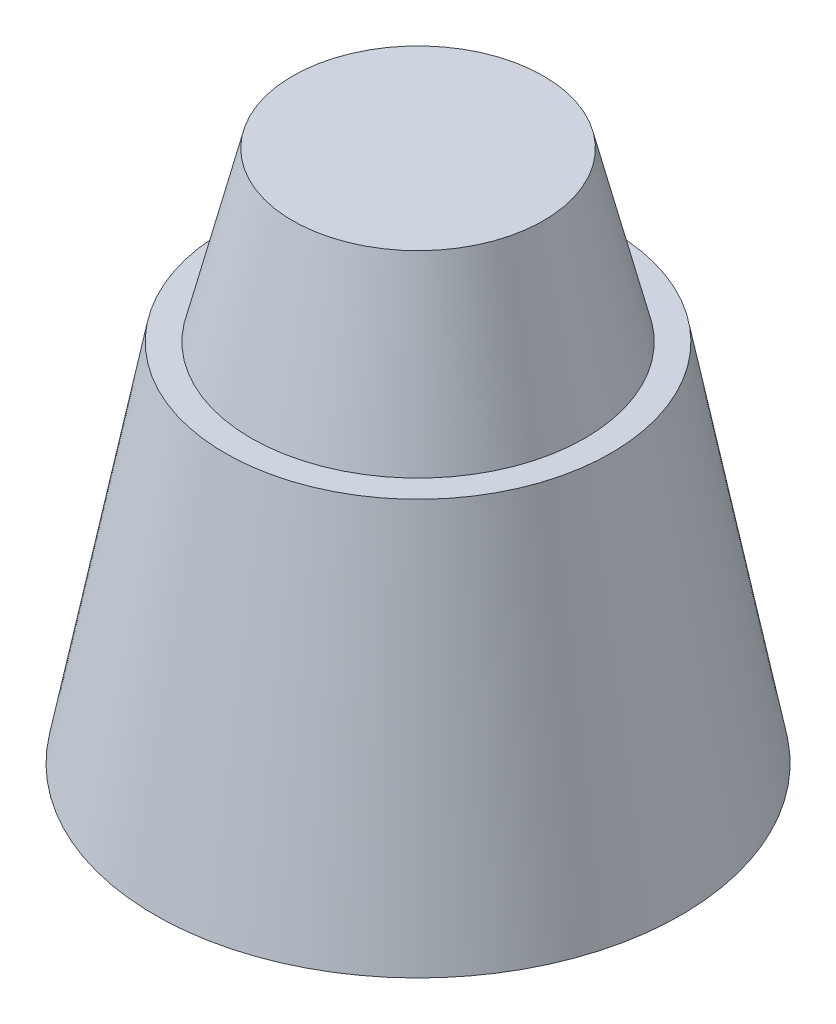
ISO-10303-21;
HEADER;
FILE_DESCRIPTION(('STEP AP214'),'2;1');
FILE_NAME('part.step','',(''),(''),'','','');
FILE_SCHEMA(('AUTOMOTIVE_DESIGN { 1 0 10303 214 1 1 1 1 }'));
ENDSEC;
DATA;
#1=APPLICATION_CONTEXT('core data for automotive mechanical design processes');
#2=APPLICATION_PROTOCOL_DEFINITION('international standard','automotive_design',2000,#1);
#3=PRODUCT_CONTEXT('',#1,'mechanical');
#4=PRODUCT('Part','Part','',(#3));
#5=PRODUCT_RELATED_PRODUCT_CATEGORY('part','',(#4));
#6=PRODUCT_DEFINITION_FORMATION('','',#4);
#7=PRODUCT_DEFINITION_CONTEXT('part definition',#1,'design');
#8=PRODUCT_DEFINITION('design','',#6,#7);
#9=PRODUCT_DEFINITION_SHAPE('','',#8);
#10=(LENGTH_UNIT() NAMED_UNIT(*) SI_UNIT(.MILLI.,.METRE.));
#11=(NAMED_UNIT(*) PLANE_ANGLE_UNIT() SI_UNIT($,.RADIAN.));
#12=(NAMED_UNIT(*) SI_UNIT($,.STERADIAN.) SOLID_ANGLE_UNIT());
#13=UNCERTAINTY_MEASURE_WITH_UNIT(LENGTH_MEASURE(1.E-05),#10,'distance_accuracy_value','');
#14=(GEOMETRIC_REPRESENTATION_CONTEXT(3) GLOBAL_UNCERTAINTY_ASSIGNED_CONTEXT((#13)) GLOBAL_UNIT_ASSIGNED_CONTEXT((#10,
#11,#12)) REPRESENTATION_CONTEXT('',''));
#15=CARTESIAN_POINT('',(0.,0.,0.));
#16=DIRECTION('',(0.,0.,1.));
#17=DIRECTION('',(1.,0.,0.));
#18=AXIS2_PLACEMENT_3D('',#15,#16,#17);
#19=CARTESIAN_POINT('',(561.480624089199,42.6222753970315,0.));
#20=DIRECTION('',(0.,-1.,0.));
#21=DIRECTION('',(0.,0.,-1.));
#22=AXIS2_PLACEMENT_3D('',#19,#20,#21);
#23=PLANE('',#22);
#24=CARTESIAN_POINT('',(570.080624089199,42.6222753970315,0.));
#25=DIRECTION('',(0.,-1.,0.));
#26=DIRECTION('',(0.,0.,-1.));
#27=AXIS2_PLACEMENT_3D('',#24,#25,#26);
#28=CIRCLE('',#27,8.60000000000005);
#29=CARTESIAN_POINT('',(570.080624089199,42.6222753970315,-8.60000000000005));
#30=VERTEX_POINT('',#29);
#31=EDGE_CURVE('E10',#30,#30,#28,.T.);
#32=ORIENTED_EDGE('',*,*,#31,.F.);
#33=EDGE_LOOP('',(#32));
#34=FACE_BOUND('',#33,.T.);
#35=ADVANCED_FACE('F42',(#34),#23,.F.);
#36=CARTESIAN_POINT('',(570.080624089199,42.6222753970315,0.));
#37=DIRECTION('',(0.,-1.,0.));
#38=DIRECTION('',(0.,0.,-1.));
#39=AXIS2_PLACEMENT_3D('',#36,#37,#38);
#40=CONICAL_SURFACE('',#39,8.60000000000005,0.243153847634139);
#41=CARTESIAN_POINT('',(570.080624089199,31.1336409521948,0.));
#42=DIRECTION('',(0.,-1.,0.));
#43=DIRECTION('',(0.,0.,-1.));
#44=AXIS2_PLACEMENT_3D('',#41,#42,#43);
#45=CIRCLE('',#44,11.4498938157735);
#46=CARTESIAN_POINT('',(570.080624089199,31.1336409521948,-11.4498938157735));
#47=VERTEX_POINT('',#46);
#48=EDGE_CURVE('E50',#47,#47,#45,.T.);
#49=ORIENTED_EDGE('',*,*,#48,.F.);
#50=EDGE_LOOP('',(#49));
#51=FACE_BOUND('',#50,.T.);
#52=ORIENTED_EDGE('',*,*,#31,.T.);
#53=EDGE_LOOP('',(#52));
#54=FACE_BOUND('',#53,.T.);
#55=ADVANCED_FACE('F97',(#51,#54),#40,.T.);
#56=CARTESIAN_POINT('',(558.630730273426,31.1336409521948,0.));
#57=DIRECTION('',(0.,-1.,0.));
#58=DIRECTION('',(0.,0.,-1.));
#59=AXIS2_PLACEMENT_3D('',#56,#57,#58);
#60=PLANE('',#59);
#61=CARTESIAN_POINT('',(570.080624089199,31.1336409521948,0.));
#62=DIRECTION('',(0.,-1.,0.));
#63=DIRECTION('',(0.,0.,-1.));
#64=AXIS2_PLACEMENT_3D('',#61,#62,#63);
#65=CIRCLE('',#64,13.2310774506319);
#66=CARTESIAN_POINT('',(570.080624089199,31.1336409521948,-13.2310774506319));
#67=VERTEX_POINT('',#66);
#68=EDGE_CURVE('E55',#67,#67,#65,.T.);
#69=ORIENTED_EDGE('',*,*,#68,.F.);
#70=EDGE_LOOP('',(#69));
#71=FACE_BOUND('',#70,.T.);
#72=ORIENTED_EDGE('',*,*,#48,.T.);
#73=EDGE_LOOP('',(#72));
#74=FACE_BOUND('',#73,.T.);
#75=ADVANCED_FACE('F102',(#71,#74),#60,.F.);
#76=CARTESIAN_POINT('',(570.080624089199,31.1336409521948,0.));
#77=DIRECTION('',(0.,-1.,0.));
#78=DIRECTION('',(0.,0.,-1.));
#79=AXIS2_PLACEMENT_3D('',#76,#77,#78);
#80=CONICAL_SURFACE('',#79,13.2310774506319,0.189856292143351);
#81=CARTESIAN_POINT('',(570.080624089199,6.10801088243434,0.));
#82=DIRECTION('',(0.,-1.,0.));
#83=DIRECTION('',(0.,0.,-1.));
#84=AXIS2_PLACEMENT_3D('',#81,#82,#83);
#85=CIRCLE('',#84,18.0402732647497);
#86=CARTESIAN_POINT('',(570.080624089199,6.10801088243434,-18.0402732647497));
#87=VERTEX_POINT('',#86);
#88=EDGE_CURVE('E60',#87,#87,#85,.T.);
#89=ORIENTED_EDGE('',*,*,#88,.F.);
#90=EDGE_LOOP('',(#89));
#91=FACE_BOUND('',#90,.T.);
#92=ORIENTED_EDGE('',*,*,#68,.T.);
#93=EDGE_LOOP('',(#92));
#94=FACE_BOUND('',#93,.T.);
#95=ADVANCED_FACE('F93',(#91,#94),#80,.T.);
#96=CARTESIAN_POINT('',(570.080624089199,6.10801088243434,0.));
#97=DIRECTION('',(0.,1.,0.));
#98=DIRECTION('',(0.,0.,1.));
#99=AXIS2_PLACEMENT_3D('',#96,#97,#98);
#100=PLANE('',#99);
#101=CARTESIAN_POINT('',(570.080624089199,6.10801088243434,0.));
#102=DIRECTION('',(0.,-1.,0.));
#103=DIRECTION('',(0.,0.,-1.));
#104=AXIS2_PLACEMENT_3D('',#101,#102,#103);
#105=CIRCLE('',#104,12.2699891295044);
#106=CARTESIAN_POINT('',(570.080624089199,6.10801088243434,-12.2699891295044));
#107=VERTEX_POINT('',#106);
#108=EDGE_CURVE('E66',#107,#107,#105,.T.);
#109=ORIENTED_EDGE('',*,*,#108,.F.);
#110=EDGE_LOOP('',(#109));
#111=FACE_BOUND('',#110,.T.);
#112=ORIENTED_EDGE('',*,*,#88,.T.);
#113=EDGE_LOOP('',(#112));
#114=FACE_BOUND('',#113,.T.);
#115=ADVANCED_FACE('F88',(#111,#114),#100,.F.);
#116=CARTESIAN_POINT('',(570.080624089199,6.10801088243435,0.));
#117=DIRECTION('',(0.,-1.,0.));
#118=DIRECTION('',(0.,0.,-1.));
#119=AXIS2_PLACEMENT_3D('',#116,#117,#118);
#120=DEGENERATE_TOROIDAL_SURFACE('',#119,2.26998912950443,10.,.T.);
#121=ORIENTED_EDGE('',*,*,#108,.T.);
#122=EDGE_LOOP('',(#121));
#123=FACE_BOUND('',#122,.T.);
#124=CARTESIAN_POINT('',(570.080624089199,16.1080108824343,0.));
#125=DIRECTION('',(0.,-1.,0.));
#126=DIRECTION('',(0.,0.,-1.));
#127=AXIS2_PLACEMENT_3D('',#124,#125,#126);
#128=CIRCLE('',#127,2.26998912950434);
#129=CARTESIAN_POINT('',(570.080624089199,16.1080108824343,-2.26998912950434));
#130=VERTEX_POINT('',#129);
#131=EDGE_CURVE('E71',#130,#130,#128,.T.);
#132=ORIENTED_EDGE('',*,*,#131,.F.);
#133=EDGE_LOOP('',(#132));
#134=FACE_BOUND('',#133,.T.);
#135=ADVANCED_FACE('F44',(#123,#134),#120,.F.);
#136=CARTESIAN_POINT('',(570.080624089199,26.1080108824343,0.));
#137=DIRECTION('',(0.,-1.,0.));
#138=DIRECTION('',(0.,0.,-1.));
#139=AXIS2_PLACEMENT_3D('',#136,#137,#138);
#140=CYLINDRICAL_SURFACE('',#139,2.26998912950434);
#141=CARTESIAN_POINT('',(570.080624089199,26.1080108824343,0.));
#142=DIRECTION('',(0.,-1.,0.));
#143=DIRECTION('',(0.,0.,-1.));
#144=AXIS2_PLACEMENT_3D('',#141,#142,#143);
#145=CIRCLE('',#144,2.26998912950434);
#146=CARTESIAN_POINT('',(570.080624089199,26.1080108824343,-2.26998912950434));
#147=VERTEX_POINT('',#146);
#148=EDGE_CURVE('E70',#147,#147,#145,.T.);
#149=ORIENTED_EDGE('',*,*,#148,.F.);
#150=EDGE_LOOP('',(#149));
#151=FACE_BOUND('',#150,.T.);
#152=ORIENTED_EDGE('',*,*,#131,.T.);
#153=EDGE_LOOP('',(#152));
#154=FACE_BOUND('',#153,.T.);
#155=ADVANCED_FACE('F81',(#151,#154),#140,.F.);
#156=CARTESIAN_POINT('',(570.080624089199,26.1080108824343,0.));
#157=DIRECTION('',(0.,-1.,0.));
#158=DIRECTION('',(0.,0.,-1.));
#159=AXIS2_PLACEMENT_3D('',#156,#157,#158);
#160=PLANE('',#159);
#161=ORIENTED_EDGE('',*,*,#148,.T.);
#162=EDGE_LOOP('',(#161));
#163=FACE_BOUND('',#162,.T.);
#164=ADVANCED_FACE('F79',(#163),#160,.T.);
#165=CLOSED_SHELL('',(#35,#55,#75,#95,#115,#135,#155,#164));
#166=MANIFOLD_SOLID_BREP('B2',#165);
#167=ADVANCED_BREP_SHAPE_REPRESENTATION('',(#18,#166),#14);
#168=SHAPE_DEFINITION_REPRESENTATION(#9,#167);
ENDSEC;
END-ISO-10303-21;
